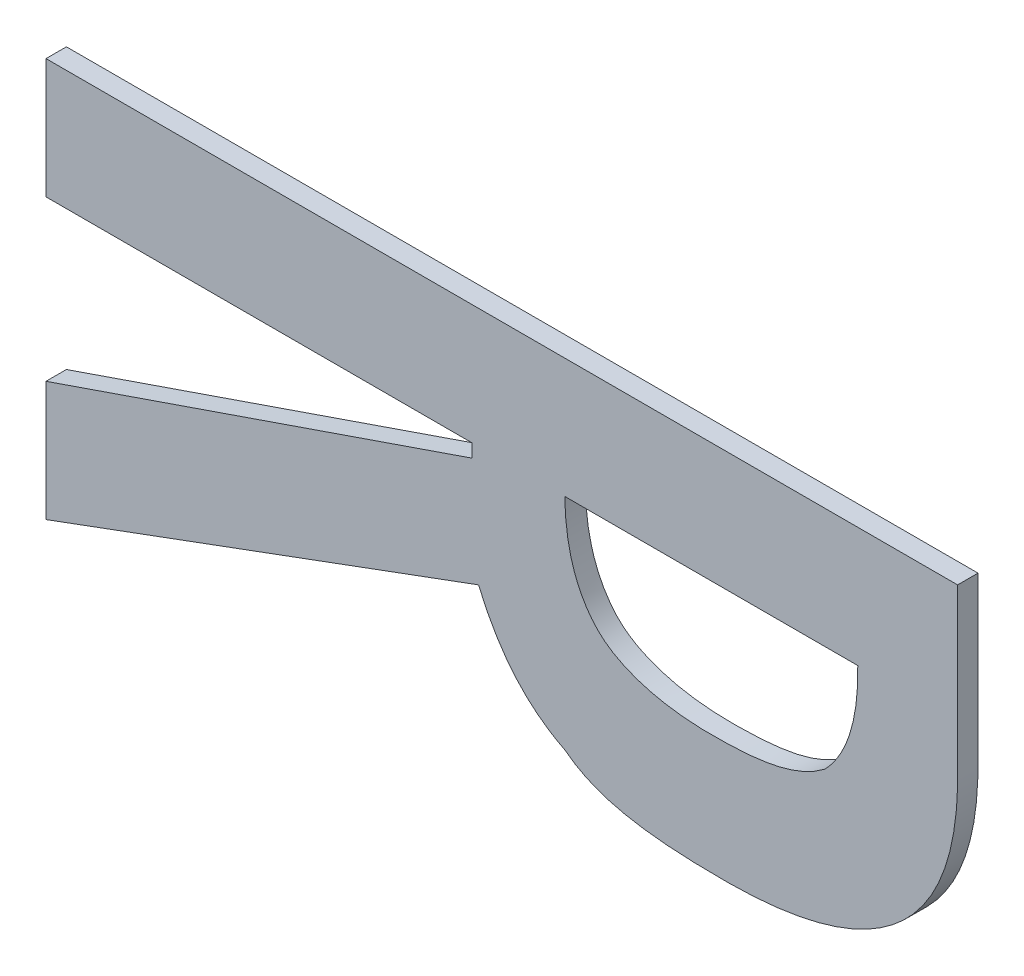
ISO-10303-21;
HEADER;
FILE_DESCRIPTION(('STEP AP214'),'2;1');
FILE_NAME('part.step','',(''),(''),'','','');
FILE_SCHEMA(('AUTOMOTIVE_DESIGN { 1 0 10303 214 1 1 1 1 }'));
ENDSEC;
DATA;
#1=APPLICATION_CONTEXT('core data for automotive mechanical design processes');
#2=APPLICATION_PROTOCOL_DEFINITION('international standard','automotive_design',2000,#1);
#3=PRODUCT_CONTEXT('',#1,'mechanical');
#4=PRODUCT('Part','Part','',(#3));
#5=PRODUCT_RELATED_PRODUCT_CATEGORY('part','',(#4));
#6=PRODUCT_DEFINITION_FORMATION('','',#4);
#7=PRODUCT_DEFINITION_CONTEXT('part definition',#1,'design');
#8=PRODUCT_DEFINITION('design','',#6,#7);
#9=PRODUCT_DEFINITION_SHAPE('','',#8);
#10=(LENGTH_UNIT() NAMED_UNIT(*) SI_UNIT(.MILLI.,.METRE.));
#11=(NAMED_UNIT(*) PLANE_ANGLE_UNIT() SI_UNIT($,.RADIAN.));
#12=(NAMED_UNIT(*) SI_UNIT($,.STERADIAN.) SOLID_ANGLE_UNIT());
#13=UNCERTAINTY_MEASURE_WITH_UNIT(LENGTH_MEASURE(1.E-05),#10,'distance_accuracy_value','');
#14=(GEOMETRIC_REPRESENTATION_CONTEXT(3) GLOBAL_UNCERTAINTY_ASSIGNED_CONTEXT((#13)) GLOBAL_UNIT_ASSIGNED_CONTEXT((#10,
#11,#12)) REPRESENTATION_CONTEXT('',''));
#15=CARTESIAN_POINT('',(0.,0.,0.));
#16=DIRECTION('',(0.,0.,1.));
#17=DIRECTION('',(1.,0.,0.));
#18=AXIS2_PLACEMENT_3D('',#15,#16,#17);
#19=CARTESIAN_POINT('',(-4.103824918965,-11.72933955655,51.9009));
#20=DIRECTION('',(0.,0.,-1.));
#21=DIRECTION('',(-1.,0.,0.));
#22=AXIS2_PLACEMENT_3D('',#19,#20,#21);
#23=PLANE('',#22);
#24=CARTESIAN_POINT('',(-4.234259701574,-11.55977433916,51.9009));
#25=CARTESIAN_POINT('',(-4.22729371960321,-11.552743189971,51.9009));
#26=CARTESIAN_POINT('',(-4.22168818160371,-11.5447199932382,51.9009));
#27=CARTESIAN_POINT('',(-4.21054037672769,-11.5231521968781,51.9009));
#28=CARTESIAN_POINT('',(-4.20641254016962,-11.5088445509134,51.9009));
#29=CARTESIAN_POINT('',(-4.20307244501397,-11.4879917727827,51.9009));
#30=CARTESIAN_POINT('',(-4.20240379489641,-11.4815388863996,51.9009));
#31=CARTESIAN_POINT('',(-4.20183339354768,-11.4717957595793,51.9009));
#32=CARTESIAN_POINT('',(-4.20171575810577,-11.4685243910132,51.9009));
#33=CARTESIAN_POINT('',(-4.2016531207676,-11.4636154110281,51.9009));
#34=CARTESIAN_POINT('',(-4.2016512462555,-11.4619777149783,51.9009));
#35=CARTESIAN_POINT('',(-4.20165094583535,-11.4599305304802,51.9009));
#36=CARTESIAN_POINT('',(-4.201650987896,-11.4595210735979,51.9009));
#37=CARTESIAN_POINT('',(-4.201651023948,-11.4587021608238,51.9009));
#38=CARTESIAN_POINT('',(-4.20165101793933,-11.4582927049319,51.9009));
#39=CARTESIAN_POINT('',(-4.20165098188734,-11.4570643376278,51.9009));
#40=CARTESIAN_POINT('',(-4.20165093381801,-11.4562454265869,51.9009));
#41=CARTESIAN_POINT('',(-4.201651005922,-11.45542651307,51.9009));
#42=B_SPLINE_CURVE_WITH_KNOTS('',3,(#24,#25,#26,#27,#28,#29,#30,#31,#32,#33,#34,#35,#36,#37,#38,
#39,#40,#41),.UNSPECIFIED.,.F.,.F.,(4,2,2,2,2,2,2,2,4),(0.,0.0291820709373025,
0.0728591681443923,0.0923314198639021,0.102145248563685,0.107058452580759,0.108286820627707,
0.109515188674654,0.111971924768555),.UNSPECIFIED.);
#43=CARTESIAN_POINT('',(-4.234259701574,-11.55977433916,51.9009));
#44=VERTEX_POINT('',#43);
#45=CARTESIAN_POINT('',(-4.201651005922,-11.45542651307,51.9009));
#46=VERTEX_POINT('',#45);
#47=EDGE_CURVE('E128',#44,#46,#42,.T.);
#48=ORIENTED_EDGE('',*,*,#47,.T.);
#49=DIRECTION('',(1.,0.,0.));
#50=VECTOR('',#49,1.);
#51=CARTESIAN_POINT('',(-4.3451292667915,-11.45542651307,51.9009));
#52=LINE('',#51,#50);
#53=CARTESIAN_POINT('',(-4.488607527661,-11.45542651307,51.9009));
#54=VERTEX_POINT('',#53);
#55=EDGE_CURVE('E126',#54,#46,#52,.T.);
#56=ORIENTED_EDGE('',*,*,#55,.F.);
#57=CARTESIAN_POINT('',(-4.488607527661,-11.45542651307,51.9009));
#58=CARTESIAN_POINT('',(-4.48859217431152,-11.4650107960418,51.9009));
#59=CARTESIAN_POINT('',(-4.48802745777342,-11.4746928983259,51.9009));
#60=CARTESIAN_POINT('',(-4.48534460191603,-11.4940421550611,51.9009));
#61=CARTESIAN_POINT('',(-4.48319289759382,-11.5037043912539,51.9009));
#62=CARTESIAN_POINT('',(-4.47829486386311,-11.5180871294826,51.9009));
#63=CARTESIAN_POINT('',(-4.47627001546353,-11.5230475148447,51.9009));
#64=CARTESIAN_POINT('',(-4.47154640819921,-11.5326127973051,51.9009));
#65=CARTESIAN_POINT('',(-4.46885156619462,-11.5372195637184,51.9009));
#66=CARTESIAN_POINT('',(-4.46423272554417,-11.5437752068317,51.9009));
#67=CARTESIAN_POINT('',(-4.462580194327,-11.5459182285779,51.9009));
#68=CARTESIAN_POINT('',(-4.45909679354082,-11.5500529807457,51.9009));
#69=CARTESIAN_POINT('',(-4.45726613066443,-11.5520448818505,51.9009));
#70=CARTESIAN_POINT('',(-4.45143428322909,-11.5576674986866,51.9009));
#71=CARTESIAN_POINT('',(-4.44709145579389,-11.5609479355003,51.9009));
#72=CARTESIAN_POINT('',(-4.43686710712427,-11.567353849471,51.9009));
#73=CARTESIAN_POINT('',(-4.43086169335597,-11.5702691710009,51.9009));
#74=CARTESIAN_POINT('',(-4.41847845383723,-11.5752107110331,51.9009));
#75=CARTESIAN_POINT('',(-4.41209884097366,-11.5772321888981,51.9009));
#76=CARTESIAN_POINT('',(-4.3934000914075,-11.582060599396,51.9009));
#77=CARTESIAN_POINT('',(-4.38084922922044,-11.5839647721148,51.9009));
#78=CARTESIAN_POINT('',(-4.35560801310814,-11.5859578978248,51.9009));
#79=CARTESIAN_POINT('',(-4.34291729970915,-11.5860394486285,51.9009));
#80=CARTESIAN_POINT('',(-4.32090604984486,-11.5853883035903,51.9009));
#81=CARTESIAN_POINT('',(-4.31157733692508,-11.5848642015688,51.9009));
#82=CARTESIAN_POINT('',(-4.29309997306678,-11.582816763118,51.9009));
#83=CARTESIAN_POINT('',(-4.28395045774023,-11.5813038201231,51.9009));
#84=CARTESIAN_POINT('',(-4.26777903298391,-11.5770612893029,51.9009));
#85=CARTESIAN_POINT('',(-4.26068775131389,-11.5746234397066,51.9009));
#86=CARTESIAN_POINT('',(-4.25045051862896,-11.5698993073137,51.9009));
#87=CARTESIAN_POINT('',(-4.24706926685425,-11.5681205727284,51.9009));
#88=CARTESIAN_POINT('',(-4.24050329964961,-11.5642095575683,51.9009));
#89=CARTESIAN_POINT('',(-4.23731924947467,-11.5620761611719,51.9009));
#90=CARTESIAN_POINT('',(-4.234259701574,-11.55977433916,51.9009));
#91=B_SPLINE_CURVE_WITH_KNOTS('',3,(#57,#58,#59,#60,#61,#62,#63,#64,#65,#66,#67,#68,#69,#70,#71,
#72,#73,#74,#75,#76,#77,#78,#79,#80,#81,#82,#83,#84,#85,#86,#87,#88,#89,#90),.UNSPECIFIED.,.F.,
.F.,(4,2,2,2,2,2,2,2,2,2,2,2,2,2,2,2,4),(0.,0.0288997839857638,0.0584289927609445,
0.0744592486970659,0.0903979071785619,0.09850833663089,0.106609465003374,0.122802012704199,
0.142728370075268,0.162759178169796,0.200621692160706,0.238637948801372,0.266651605592957,
0.29437545374279,0.316739822929715,0.328180811802465,0.339658501744322),.UNSPECIFIED.);
#92=EDGE_CURVE('E187',#54,#44,#91,.T.);
#93=ORIENTED_EDGE('',*,*,#92,.T.);
#94=EDGE_LOOP('',(#48,#56,#93));
#95=FACE_BOUND('',#94,.T.);
#96=CARTESIAN_POINT('',(-4.488607527661,-11.67064390438,51.9009));
#97=CARTESIAN_POINT('',(-4.49655290488034,-11.6667184582125,51.9009));
#98=CARTESIAN_POINT('',(-4.50413351501535,-11.6620817320312,51.9009));
#99=CARTESIAN_POINT('',(-4.51831250234966,-11.6516492202193,51.9009));
#100=CARTESIAN_POINT('',(-4.52492153248166,-11.6458679439648,51.9009));
#101=CARTESIAN_POINT('',(-4.53860121447045,-11.6317605926403,51.9009));
#102=CARTESIAN_POINT('',(-4.54538516991811,-11.6231583894018,51.9009));
#103=CARTESIAN_POINT('',(-4.55750564624394,-11.6049780811365,51.9009));
#104=CARTESIAN_POINT('',(-4.56283637428216,-11.5953962738909,51.9009));
#105=CARTESIAN_POINT('',(-4.56962744218233,-11.5813471999078,51.9009));
#106=CARTESIAN_POINT('',(-4.57155392744367,-11.5770988342393,51.9009));
#107=CARTESIAN_POINT('',(-4.573390136356,-11.57281781742,51.9009));
#108=B_SPLINE_CURVE_WITH_KNOTS('',3,(#96,#97,#98,#99,#100,#101,#102,#103,#104,#105,#106,#107),
.UNSPECIFIED.,.F.,.F.,(4,2,2,2,2,4),(0.,0.0265348588052677,0.0527526996096151,
0.0854229784977777,0.118221643844576,0.132206858519135),.UNSPECIFIED.);
#109=CARTESIAN_POINT('',(-4.488607527661,-11.67064390438,51.9009));
#110=VERTEX_POINT('',#109);
#111=CARTESIAN_POINT('',(-4.573390136356,-11.57281781742,51.9009));
#112=VERTEX_POINT('',#111);
#113=EDGE_CURVE('E22',#110,#112,#108,.T.);
#114=ORIENTED_EDGE('',*,*,#113,.T.);
#115=DIRECTION('',(0.938096474139897,0.346374082757781,0.));
#116=VECTOR('',#115,1.);
#117=CARTESIAN_POINT('',(-4.7853466580955,-11.651078686985,51.9009));
#118=LINE('',#117,#116);
#119=CARTESIAN_POINT('',(-4.997303179835,-11.72933955655,51.9009));
#120=VERTEX_POINT('',#119);
#121=EDGE_CURVE('E94',#120,#112,#118,.T.);
#122=ORIENTED_EDGE('',*,*,#121,.F.);
#123=DIRECTION('',(0.,-1.,0.));
#124=VECTOR('',#123,1.);
#125=CARTESIAN_POINT('',(-4.997303179835,-11.670643904375,51.9009));
#126=LINE('',#125,#124);
#127=CARTESIAN_POINT('',(-4.997303179835,-11.6119482522,51.9009));
#128=VERTEX_POINT('',#127);
#129=EDGE_CURVE('E129',#128,#120,#126,.T.);
#130=ORIENTED_EDGE('',*,*,#129,.F.);
#131=DIRECTION('',(-0.945686599304607,-0.325079768511804,0.));
#132=VECTOR('',#131,1.);
#133=CARTESIAN_POINT('',(-4.788607527661,-11.540209121765,51.9009));
#134=LINE('',#133,#132);
#135=CARTESIAN_POINT('',(-4.579911875487,-11.46846999133,51.9009));
#136=VERTEX_POINT('',#135);
#137=EDGE_CURVE('E118',#136,#128,#134,.T.);
#138=ORIENTED_EDGE('',*,*,#137,.F.);
#139=DIRECTION('',(0.,-1.,0.));
#140=VECTOR('',#139,1.);
#141=CARTESIAN_POINT('',(-4.579911875487,-11.4619482522,51.9009));
#142=LINE('',#141,#140);
#143=CARTESIAN_POINT('',(-4.579911875487,-11.45542651307,51.9009));
#144=VERTEX_POINT('',#143);
#145=EDGE_CURVE('E152',#144,#136,#142,.T.);
#146=ORIENTED_EDGE('',*,*,#145,.F.);
#147=DIRECTION('',(1.,0.,0.));
#148=VECTOR('',#147,1.);
#149=CARTESIAN_POINT('',(-4.788607527661,-11.45542651307,51.9009));
#150=LINE('',#149,#148);
#151=CARTESIAN_POINT('',(-4.997303179835,-11.45542651307,51.9009));
#152=VERTEX_POINT('',#151);
#153=EDGE_CURVE('E262',#152,#144,#150,.T.);
#154=ORIENTED_EDGE('',*,*,#153,.F.);
#155=DIRECTION('',(0.,-1.,0.));
#156=VECTOR('',#155,1.);
#157=CARTESIAN_POINT('',(-4.997303179835,-11.3967308609,51.9009));
#158=LINE('',#157,#156);
#159=CARTESIAN_POINT('',(-4.997303179835,-11.33803520873,51.9009));
#160=VERTEX_POINT('',#159);
#161=EDGE_CURVE('E143',#160,#152,#158,.T.);
#162=ORIENTED_EDGE('',*,*,#161,.F.);
#163=DIRECTION('',(-1.,0.,0.));
#164=VECTOR('',#163,1.);
#165=CARTESIAN_POINT('',(-4.5505640494,-11.33803520873,51.9009));
#166=LINE('',#165,#164);
#167=CARTESIAN_POINT('',(-4.103824918965,-11.33803520873,51.9009));
#168=VERTEX_POINT('',#167);
#169=EDGE_CURVE('E136',#168,#160,#166,.T.);
#170=ORIENTED_EDGE('',*,*,#169,.F.);
#171=CARTESIAN_POINT('',(-4.103824918965,-11.33803520873,51.9009));
#172=CARTESIAN_POINT('',(-4.1038250178631,-11.3572352039676,51.9009));
#173=CARTESIAN_POINT('',(-4.10382495193103,-11.3764352071425,51.9009));
#174=CARTESIAN_POINT('',(-4.10382490248198,-11.4052352095237,51.9009));
#175=CARTESIAN_POINT('',(-4.10382489424047,-11.4148352099206,51.9009));
#176=CARTESIAN_POINT('',(-4.10382493132726,-11.4292352081347,51.9009));
#177=CARTESIAN_POINT('',(-4.10382495193103,-11.4340352071425,51.9009));
#178=CARTESIAN_POINT('',(-4.10382488599897,-11.4436352103174,51.9009));
#179=CARTESIAN_POINT('',(-4.10382479946313,-11.4484352144845,51.9009));
#180=CARTESIAN_POINT('',(-4.10382503846687,-11.4580352029755,51.9009));
#181=CARTESIAN_POINT('',(-4.10382536400645,-11.4628351872994,51.9009));
#182=CARTESIAN_POINT('',(-4.10382480770464,-11.4688352140876,51.9009));
#183=CARTESIAN_POINT('',(-4.10382464828296,-11.4700352217645,51.9009));
#184=CARTESIAN_POINT('',(-4.10382600169316,-11.4760351565921,51.9009));
#185=CARTESIAN_POINT('',(-4.10383396608077,-11.4808347730732,51.9009));
#186=CARTESIAN_POINT('',(-4.10380678475703,-11.495257291698,51.9009));
#187=CARTESIAN_POINT('',(-4.10372030352894,-11.5048826658634,51.9009));
#188=CARTESIAN_POINT('',(-4.10444760732287,-11.5241071450207,51.9009));
#189=CARTESIAN_POINT('',(-4.10526087381475,-11.5337062619502,51.9009));
#190=CARTESIAN_POINT('',(-4.10794096199321,-11.5528517571005,51.9009));
#191=CARTESIAN_POINT('',(-4.10981740049867,-11.5623968392133,51.9009));
#192=CARTESIAN_POINT('',(-4.11488531074728,-11.5811510510154,51.9009));
#193=CARTESIAN_POINT('',(-4.11807714295075,-11.5903600878641,51.9009));
#194=CARTESIAN_POINT('',(-4.12557306007983,-11.6072377472004,51.9009));
#195=CARTESIAN_POINT('',(-4.12973502199263,-11.6149684935133,51.9009));
#196=CARTESIAN_POINT('',(-4.1393089643298,-11.6296063984846,51.9009));
#197=CARTESIAN_POINT('',(-4.14471919433958,-11.6365146900751,51.9009));
#198=CARTESIAN_POINT('',(-4.15666907295288,-11.6492801227417,51.9009));
#199=CARTESIAN_POINT('',(-4.1632094482896,-11.6551365824709,51.9009));
#200=CARTESIAN_POINT('',(-4.17716906409425,-11.6656932098829,51.9009));
#201=CARTESIAN_POINT('',(-4.18458960178304,-11.6703916386398,51.9009));
#202=CARTESIAN_POINT('',(-4.20306488684662,-11.6802940668158,51.9009));
#203=CARTESIAN_POINT('',(-4.21440036214594,-11.6849690288362,51.9009));
#204=CARTESIAN_POINT('',(-4.23766545204889,-11.6925138845642,51.9009));
#205=CARTESIAN_POINT('',(-4.24959704235428,-11.6953772778416,51.9009));
#206=CARTESIAN_POINT('',(-4.27327603284909,-11.6996117760799,51.9009));
#207=CARTESIAN_POINT('',(-4.2850151487002,-11.7010318304467,51.9009));
#208=CARTESIAN_POINT('',(-4.30268630600238,-11.7024027821786,51.9009));
#209=CARTESIAN_POINT('',(-4.30859341937884,-11.7027331904651,51.9009));
#210=CARTESIAN_POINT('',(-4.32041692753336,-11.703150483807,51.9009));
#211=CARTESIAN_POINT('',(-4.32633332330732,-11.7032373406474,51.9009));
#212=CARTESIAN_POINT('',(-4.33818540692432,-11.7032678880829,51.9009));
#213=CARTESIAN_POINT('',(-4.34412109302252,-11.7032110982624,51.9009));
#214=CARTESIAN_POINT('',(-4.35599021743288,-11.7029918191787,51.9009));
#215=CARTESIAN_POINT('',(-4.36192365570093,-11.7028293279392,51.9009));
#216=CARTESIAN_POINT('',(-4.37970032097444,-11.702104499773,51.9009));
#217=CARTESIAN_POINT('',(-4.39153817397237,-11.7013050403133,51.9009));
#218=CARTESIAN_POINT('',(-4.41251204408465,-11.6989015532327,51.9009));
#219=CARTESIAN_POINT('',(-4.42167105301735,-11.6975125123098,51.9009));
#220=CARTESIAN_POINT('',(-4.43968912644469,-11.693690827672,51.9009));
#221=CARTESIAN_POINT('',(-4.44855038860084,-11.6912699031725,51.9009));
#222=CARTESIAN_POINT('',(-4.46271141595168,-11.6859541707029,51.9009));
#223=CARTESIAN_POINT('',(-4.46817592120408,-11.6835187208186,51.9009));
#224=CARTESIAN_POINT('',(-4.47874920632549,-11.6777792080625,51.9009));
#225=CARTESIAN_POINT('',(-4.48384978061855,-11.6744602540145,51.9009));
#226=CARTESIAN_POINT('',(-4.488607527661,-11.67064390438,51.9009));
#227=B_SPLINE_CURVE_WITH_KNOTS('',3,(#171,#172,#173,#174,#175,#176,#177,#178,#179,#180,#181,
#182,#183,#184,#185,#186,#187,#188,#189,#190,#191,#192,#193,#194,#195,#196,#197,#198,#199,#200,
#201,#202,#203,#204,#205,#206,#207,#208,#209,#210,#211,#212,#213,#214,#215,#216,#217,#218,#219,
#220,#221,#222,#223,#224,#225,#226),.UNSPECIFIED.,.F.,.F.,(4,2,2,2,2,2,2,2,2,2,2,2,2,2,2,2,2,2,
2,2,2,2,2,2,2,2,2,4),(0.,0.0575999999999927,0.08639999999999,0.100799999999988,
0.115199999999985,0.129599999999985,0.133199999999984,0.147599999999984,0.17646362918816,
0.205310632750334,0.234422832819535,0.263543015881341,0.2897681752959,0.315956780972994,
0.342162290176948,0.368406913655974,0.404982611984993,0.441688820985321,0.477103861066305,
0.494849154354383,0.512596503313845,0.530403285399241,0.54821040041557,0.583769832718061,
0.611528098807963,0.638979176162854,0.656861229324732,0.67506619527688),.UNSPECIFIED.);
#228=EDGE_CURVE('E88',#168,#110,#227,.T.);
#229=ORIENTED_EDGE('',*,*,#228,.T.);
#230=EDGE_LOOP('',(#114,#122,#130,#138,#146,#154,#162,#170,#229));
#231=FACE_BOUND('',#230,.T.);
#232=ADVANCED_FACE('F17',(#95,#231),#23,.T.);
#233=CARTESIAN_POINT('',(-4.997303179835,-11.72933955655,51.9209));
#234=DIRECTION('',(0.346374082757781,-0.938096474139897,0.));
#235=DIRECTION('',(0.,0.,-1.));
#236=AXIS2_PLACEMENT_3D('',#233,#234,#235);
#237=PLANE('',#236);
#238=DIRECTION('',(0.,0.,1.));
#239=VECTOR('',#238,1.);
#240=CARTESIAN_POINT('',(-4.997303179835,-11.72933955655,51.9109));
#241=LINE('',#240,#239);
#242=CARTESIAN_POINT('',(-4.997303179835,-11.72933955655,51.9209));
#243=VERTEX_POINT('',#242);
#244=EDGE_CURVE('E104',#120,#243,#241,.T.);
#245=ORIENTED_EDGE('',*,*,#244,.F.);
#246=ORIENTED_EDGE('',*,*,#121,.T.);
#247=DIRECTION('',(0.,0.,1.));
#248=VECTOR('',#247,1.);
#249=CARTESIAN_POINT('',(-4.573390136356,-11.57281781742,51.9153));
#250=LINE('',#249,#248);
#251=CARTESIAN_POINT('',(-4.573390136356,-11.57281781742,51.9209));
#252=VERTEX_POINT('',#251);
#253=EDGE_CURVE('E99',#112,#252,#250,.T.);
#254=ORIENTED_EDGE('',*,*,#253,.T.);
#255=DIRECTION('',(0.938096474139895,0.346374082757784,0.));
#256=VECTOR('',#255,1.);
#257=CARTESIAN_POINT('',(-4.997303179835,-11.72933955655,51.9209));
#258=LINE('',#257,#256);
#259=EDGE_CURVE('E195',#243,#252,#258,.T.);
#260=ORIENTED_EDGE('',*,*,#259,.F.);
#261=EDGE_LOOP('',(#245,#246,#254,#260));
#262=FACE_BOUND('',#261,.T.);
#263=ADVANCED_FACE('F101',(#262),#237,.T.);
#264=CARTESIAN_POINT('',(-4.488607527661,-11.67064390438,51.9009));
#265=CARTESIAN_POINT('',(-4.488607527661,-11.67064390438,51.9297));
#266=CARTESIAN_POINT('',(-4.527737962443,-11.65107868699,51.9009));
#267=CARTESIAN_POINT('',(-4.527737962443,-11.65107868699,51.9297));
#268=CARTESIAN_POINT('',(-4.553824918965,-11.61846999133,51.9009));
#269=CARTESIAN_POINT('',(-4.553824918965,-11.61846999133,51.9297));
#270=CARTESIAN_POINT('',(-4.573390136356,-11.57281781742,51.9009));
#271=CARTESIAN_POINT('',(-4.573390136356,-11.57281781742,51.9297));
#272=B_SPLINE_SURFACE_WITH_KNOTS('',3,1,((#264,#265),(#266,#267),(#268,#269),(#270,#271)),
.UNSPECIFIED.,.F.,.F.,.F.,(4,4),(2,2),(9.,10.),(0.,0.00288),.UNSPECIFIED.);
#273=CARTESIAN_POINT('',(-4.573390136356,-11.57281781742,51.9209));
#274=CARTESIAN_POINT('',(-4.56960619625491,-11.5816385806522,51.9209));
#275=CARTESIAN_POINT('',(-4.56542923546037,-11.5903381595776,51.9209));
#276=CARTESIAN_POINT('',(-4.55602263638039,-11.6072748623933,51.9209));
#277=CARTESIAN_POINT('',(-4.55078118307009,-11.6155053354528,51.9209));
#278=CARTESIAN_POINT('',(-4.53900105726735,-11.6311361772689,51.9209));
#279=CARTESIAN_POINT('',(-4.53245030323309,-11.6385277264926,51.9209));
#280=CARTESIAN_POINT('',(-4.51810258656602,-11.6519074936161,51.9209));
#281=CARTESIAN_POINT('',(-4.51031397006493,-11.6579044904372,51.9209));
#282=CARTESIAN_POINT('',(-4.49986843266559,-11.6644651215651,51.9209));
#283=CARTESIAN_POINT('',(-4.49765964992582,-11.6657759421976,51.9209));
#284=CARTESIAN_POINT('',(-4.49317902003107,-11.6682902396132,51.9209));
#285=CARTESIAN_POINT('',(-4.49090711525351,-11.6694936137872,51.9209));
#286=CARTESIAN_POINT('',(-4.488607527661,-11.67064390438,51.9209));
#287=B_SPLINE_CURVE_WITH_KNOTS('',3,(#273,#274,#275,#276,#277,#278,#279,#280,#281,#282,#283,
#284,#285,#286),.UNSPECIFIED.,.F.,.F.,(4,2,2,2,2,2,4),(0.,0.0288534947048544,0.0580467056167621,
0.0875228876180085,0.11680816070391,0.124511743141741,0.132222605361738),.UNSPECIFIED.);
#288=CARTESIAN_POINT('',(-4.488607527661,-11.67064390438,51.9209));
#289=VERTEX_POINT('',#288);
#290=EDGE_CURVE('E109',#252,#289,#287,.T.);
#291=DIRECTION('',(0.,0.,1.));
#292=VECTOR('',#291,1.);
#293=CARTESIAN_POINT('',(-4.488607527661,-11.67064390438,51.9153));
#294=LINE('',#293,#292);
#295=EDGE_CURVE('E112',#110,#289,#294,.T.);
#296=ORIENTED_EDGE('',*,*,#290,.F.);
#297=ORIENTED_EDGE('',*,*,#253,.F.);
#298=ORIENTED_EDGE('',*,*,#113,.F.);
#299=ORIENTED_EDGE('',*,*,#295,.T.);
#300=EDGE_LOOP('',(#296,#297,#298,#299));
#301=FACE_BOUND('',#300,.T.);
#302=ADVANCED_FACE('F107',(#301),#272,.F.);
#303=CARTESIAN_POINT('',(-4.103824918965,-11.33803520873,51.9009));
#304=CARTESIAN_POINT('',(-4.103824918965,-11.33803520873,51.9297));
#305=CARTESIAN_POINT('',(-4.103824918965,-11.39238303481,51.9009));
#306=CARTESIAN_POINT('',(-4.103824918965,-11.39238303481,51.9297));
#307=CARTESIAN_POINT('',(-4.103824918965,-11.4467308609,51.9009));
#308=CARTESIAN_POINT('',(-4.103824918965,-11.4467308609,51.9297));
#309=CARTESIAN_POINT('',(-4.103824918965,-11.50107868699,51.9009));
#310=CARTESIAN_POINT('',(-4.103824918965,-11.50107868699,51.9297));
#311=CARTESIAN_POINT('',(-4.103824918965,-11.63803520873,51.9009));
#312=CARTESIAN_POINT('',(-4.103824918965,-11.63803520873,51.9297));
#313=CARTESIAN_POINT('',(-4.18208578853,-11.70325260003,51.9009));
#314=CARTESIAN_POINT('',(-4.18208578853,-11.70325260003,51.9297));
#315=CARTESIAN_POINT('',(-4.33208578853,-11.70325260003,51.9009));
#316=CARTESIAN_POINT('',(-4.33208578853,-11.70325260003,51.9297));
#317=CARTESIAN_POINT('',(-4.403824918965,-11.70325260003,51.9009));
#318=CARTESIAN_POINT('',(-4.403824918965,-11.70325260003,51.9297));
#319=CARTESIAN_POINT('',(-4.455998832009,-11.6967308609,51.9009));
#320=CARTESIAN_POINT('',(-4.455998832009,-11.6967308609,51.9297));
#321=CARTESIAN_POINT('',(-4.488607527661,-11.67064390438,51.9009));
#322=CARTESIAN_POINT('',(-4.488607527661,-11.67064390438,51.9297));
#323=B_SPLINE_SURFACE_WITH_KNOTS('',3,1,((#303,#304),(#305,#306),(#307,#308),(#309,#310),(#311,
#312),(#313,#314),(#315,#316),(#317,#318),(#319,#320),(#321,#322)),.UNSPECIFIED.,.F.,.F.,.F.,(4,
3,3,4),(2,2),(6.,7.,8.,9.),(0.,0.00288),.UNSPECIFIED.);
#324=CARTESIAN_POINT('',(-4.488607527661,-11.67064390438,51.9209));
#325=CARTESIAN_POINT('',(-4.48373959816428,-11.6745476149699,51.9209));
#326=CARTESIAN_POINT('',(-4.47851422758318,-11.6779314094926,51.9209));
#327=CARTESIAN_POINT('',(-4.46768453456488,-11.6837598993687,51.9209));
#328=CARTESIAN_POINT('',(-4.46208929551117,-11.6862212117609,51.9209));
#329=CARTESIAN_POINT('',(-4.44985360417395,-11.6907368545638,51.9209));
#330=CARTESIAN_POINT('',(-4.44317641444668,-11.6926861221015,51.9209));
#331=CARTESIAN_POINT('',(-4.42966081050845,-11.6959274442814,51.9209));
#332=CARTESIAN_POINT('',(-4.42282215845123,-11.6972184567002,51.9209));
#333=CARTESIAN_POINT('',(-4.40896376516888,-11.6993441364659,51.9209));
#334=CARTESIAN_POINT('',(-4.40194289109679,-11.700170999385,51.9209));
#335=CARTESIAN_POINT('',(-4.38787375931125,-11.7014792328163,51.9209));
#336=CARTESIAN_POINT('',(-4.38082551402171,-11.7019607450121,51.9209));
#337=CARTESIAN_POINT('',(-4.36421882532953,-11.7027978919303,51.9209));
#338=CARTESIAN_POINT('',(-4.35465565701709,-11.7030485068227,51.9209));
#339=CARTESIAN_POINT('',(-4.33552737118368,-11.7033028226251,51.9209));
#340=CARTESIAN_POINT('',(-4.32596225414326,-11.7033065591671,51.9209));
#341=CARTESIAN_POINT('',(-4.30692504573563,-11.7027087914155,51.9209));
#342=CARTESIAN_POINT('',(-4.29745287285806,-11.7021125837917,51.9209));
#343=CARTESIAN_POINT('',(-4.2785829672498,-11.7002253686476,51.9209));
#344=CARTESIAN_POINT('',(-4.26918532125404,-11.6989336460234,51.9209));
#345=CARTESIAN_POINT('',(-4.23795251166318,-11.6931506509653,51.9209));
#346=CARTESIAN_POINT('',(-4.21631958879115,-11.6866912778096,51.9209));
#347=CARTESIAN_POINT('',(-4.18840336611266,-11.6726273586501,51.9209));
#348=CARTESIAN_POINT('',(-4.1806321783428,-11.6679795143685,51.9209));
#349=CARTESIAN_POINT('',(-4.16598319483942,-11.6574478561328,51.9209));
#350=CARTESIAN_POINT('',(-4.15910375881709,-11.651566365085,51.9209));
#351=CARTESIAN_POINT('',(-4.14649405615546,-11.6386346262793,51.9209));
#352=CARTESIAN_POINT('',(-4.14076799008775,-11.6315802712791,51.9209));
#353=CARTESIAN_POINT('',(-4.13064653765031,-11.6165655089348,51.9209));
#354=CARTESIAN_POINT('',(-4.1262534133879,-11.6086035925332,51.9209));
#355=CARTESIAN_POINT('',(-4.11782128560265,-11.5899695205681,51.9209));
#356=CARTESIAN_POINT('',(-4.11416411635227,-11.5791270617447,51.9209));
#357=CARTESIAN_POINT('',(-4.10860960861832,-11.5570177585763,51.9209));
#358=CARTESIAN_POINT('',(-4.10671370408629,-11.5457505761899,51.9209));
#359=CARTESIAN_POINT('',(-4.10489127466922,-11.5285407327728,51.9209));
#360=CARTESIAN_POINT('',(-4.10445612064329,-11.5226436082159,51.9209));
#361=CARTESIAN_POINT('',(-4.10404197729265,-11.5137894637678,51.9209));
#362=CARTESIAN_POINT('',(-4.1039436840152,-11.5108381112164,51.9209));
#363=CARTESIAN_POINT('',(-4.10383726950914,-11.5049335805295,51.9209));
#364=CARTESIAN_POINT('',(-4.10382916304384,-11.5019804021742,51.9209));
#365=CARTESIAN_POINT('',(-4.10381644558682,-11.4931313937926,51.9209));
#366=CARTESIAN_POINT('',(-4.10382336800016,-11.4872358055149,51.9209));
#367=CARTESIAN_POINT('',(-4.10382569444742,-11.4783922542141,51.9209));
#368=CARTESIAN_POINT('',(-4.10382512706771,-11.4754443756331,51.9209));
#369=CARTESIAN_POINT('',(-4.10382471086229,-11.4695486335327,51.9209));
#370=CARTESIAN_POINT('',(-4.10382486203656,-11.4666007700131,51.9209));
#371=CARTESIAN_POINT('',(-4.10382497589343,-11.4607050390231,51.9209));
#372=CARTESIAN_POINT('',(-4.10382493857603,-11.4577571715527,51.9209));
#373=CARTESIAN_POINT('',(-4.10382487974295,-11.4489135702547,51.9209));
#374=CARTESIAN_POINT('',(-4.10382491134642,-11.4430178375406,51.9209));
#375=CARTESIAN_POINT('',(-4.10382492277429,-11.4341742377153,51.9209));
#376=CARTESIAN_POINT('',(-4.10382492058736,-11.4312263709812,51.9209));
#377=CARTESIAN_POINT('',(-4.10382491247557,-11.4164870373699,51.9209));
#378=CARTESIAN_POINT('',(-4.10382491501936,-11.4046955706702,51.9209));
#379=CARTESIAN_POINT('',(-4.10382492508505,-11.3746144723715,51.9209));
#380=CARTESIAN_POINT('',(-4.1038249345778,-11.3563248408139,51.9209));
#381=CARTESIAN_POINT('',(-4.103824918965,-11.33803520873,51.9209));
#382=B_SPLINE_CURVE_WITH_KNOTS('',3,(#324,#325,#326,#327,#328,#329,#330,#331,#332,#333,#334,
#335,#336,#337,#338,#339,#340,#341,#342,#343,#344,#345,#346,#347,#348,#349,#350,#351,#352,#353,
#354,#355,#356,#357,#358,#359,#360,#361,#362,#363,#364,#365,#366,#367,#368,#369,#370,#371,#372,
#373,#374,#375,#376,#377,#378,#379,#380,#381),.UNSPECIFIED.,.F.,.F.,(4,2,2,2,2,2,2,2,2,2,2,2,2,
2,2,2,2,2,2,2,2,2,2,2,2,2,2,2,4),(0.,0.0186215543241528,0.0368893978063514,0.0577121332737143,
0.0785677360485879,0.0997642471618759,0.120952057210614,0.149645707709013,0.178335216826169,
0.206773640661867,0.235241359870753,0.30184264572023,0.328902636682032,0.355912124991359,
0.38301827065864,0.410170163557846,0.444306989504202,0.478471583998458,0.496203970979183,
0.505061546356374,0.51392057167033,0.531607771799896,0.540451371864677,0.549294971929459,
0.558138571994241,0.575825772123808,0.58466937218859,0.620043772447719,0.674912667717572),.UNSPECIFIED.);
#383=CARTESIAN_POINT('',(-4.103824918965,-11.33803520873,51.9209));
#384=VERTEX_POINT('',#383);
#385=EDGE_CURVE('E232',#289,#384,#382,.T.);
#386=DIRECTION('',(0.,0.,-1.));
#387=VECTOR('',#386,1.);
#388=CARTESIAN_POINT('',(-4.103824918965,-11.33803520873,51.9109));
#389=LINE('',#388,#387);
#390=EDGE_CURVE('E140',#384,#168,#389,.T.);
#391=ORIENTED_EDGE('',*,*,#385,.F.);
#392=ORIENTED_EDGE('',*,*,#295,.F.);
#393=ORIENTED_EDGE('',*,*,#228,.F.);
#394=ORIENTED_EDGE('',*,*,#390,.F.);
#395=EDGE_LOOP('',(#391,#392,#393,#394));
#396=FACE_BOUND('',#395,.T.);
#397=ADVANCED_FACE('F213',(#396),#323,.F.);
#398=CARTESIAN_POINT('',(-4.997303179835,-11.33803520873,51.9009));
#399=DIRECTION('',(0.,1.,0.));
#400=DIRECTION('',(0.,0.,1.));
#401=AXIS2_PLACEMENT_3D('',#398,#399,#400);
#402=PLANE('',#401);
#403=ORIENTED_EDGE('',*,*,#390,.T.);
#404=ORIENTED_EDGE('',*,*,#169,.T.);
#405=DIRECTION('',(0.,0.,-1.));
#406=VECTOR('',#405,1.);
#407=CARTESIAN_POINT('',(-4.997303179835,-11.33803520873,51.9109));
#408=LINE('',#407,#406);
#409=CARTESIAN_POINT('',(-4.997303179835,-11.33803520873,51.9209));
#410=VERTEX_POINT('',#409);
#411=EDGE_CURVE('E139',#410,#160,#408,.T.);
#412=ORIENTED_EDGE('',*,*,#411,.F.);
#413=DIRECTION('',(-1.,0.,0.));
#414=VECTOR('',#413,1.);
#415=CARTESIAN_POINT('',(-4.5505640494,-11.33803520873,51.9209));
#416=LINE('',#415,#414);
#417=EDGE_CURVE('E238',#384,#410,#416,.T.);
#418=ORIENTED_EDGE('',*,*,#417,.F.);
#419=EDGE_LOOP('',(#403,#404,#412,#418));
#420=FACE_BOUND('',#419,.T.);
#421=ADVANCED_FACE('F219',(#420),#402,.T.);
#422=CARTESIAN_POINT('',(-4.997303179835,-11.45542651307,51.9009));
#423=DIRECTION('',(-1.,0.,0.));
#424=DIRECTION('',(0.,0.,1.));
#425=AXIS2_PLACEMENT_3D('',#422,#423,#424);
#426=PLANE('',#425);
#427=ORIENTED_EDGE('',*,*,#411,.T.);
#428=ORIENTED_EDGE('',*,*,#161,.T.);
#429=DIRECTION('',(0.,0.,-1.));
#430=VECTOR('',#429,1.);
#431=CARTESIAN_POINT('',(-4.997303179835,-11.45542651307,51.9109));
#432=LINE('',#431,#430);
#433=CARTESIAN_POINT('',(-4.997303179835,-11.45542651307,51.9209));
#434=VERTEX_POINT('',#433);
#435=EDGE_CURVE('E146',#434,#152,#432,.T.);
#436=ORIENTED_EDGE('',*,*,#435,.F.);
#437=DIRECTION('',(0.,-1.,0.));
#438=VECTOR('',#437,1.);
#439=CARTESIAN_POINT('',(-4.997303179835,-11.53368738264,51.9209));
#440=LINE('',#439,#438);
#441=EDGE_CURVE('E269',#410,#434,#440,.T.);
#442=ORIENTED_EDGE('',*,*,#441,.F.);
#443=EDGE_LOOP('',(#427,#428,#436,#442));
#444=FACE_BOUND('',#443,.T.);
#445=ADVANCED_FACE('F279',(#444),#426,.T.);
#446=CARTESIAN_POINT('',(-4.997303179835,-11.45542651307,51.9209));
#447=DIRECTION('',(0.,-1.,0.));
#448=DIRECTION('',(0.,0.,-1.));
#449=AXIS2_PLACEMENT_3D('',#446,#447,#448);
#450=PLANE('',#449);
#451=ORIENTED_EDGE('',*,*,#435,.T.);
#452=ORIENTED_EDGE('',*,*,#153,.T.);
#453=DIRECTION('',(0.,0.,-1.));
#454=VECTOR('',#453,1.);
#455=CARTESIAN_POINT('',(-4.579911875487,-11.45542651307,51.9109));
#456=LINE('',#455,#454);
#457=CARTESIAN_POINT('',(-4.579911875487,-11.45542651307,51.9209));
#458=VERTEX_POINT('',#457);
#459=EDGE_CURVE('E259',#458,#144,#456,.T.);
#460=ORIENTED_EDGE('',*,*,#459,.F.);
#461=DIRECTION('',(1.,0.,0.));
#462=VECTOR('',#461,1.);
#463=CARTESIAN_POINT('',(-4.5505640494,-11.45542651307,51.9209));
#464=LINE('',#463,#462);
#465=EDGE_CURVE('E156',#434,#458,#464,.T.);
#466=ORIENTED_EDGE('',*,*,#465,.F.);
#467=EDGE_LOOP('',(#451,#452,#460,#466));
#468=FACE_BOUND('',#467,.T.);
#469=ADVANCED_FACE('F358',(#468),#450,.T.);
#470=CARTESIAN_POINT('',(-4.579911875487,-11.46846999133,51.9009));
#471=DIRECTION('',(-1.,0.,0.));
#472=DIRECTION('',(0.,0.,1.));
#473=AXIS2_PLACEMENT_3D('',#470,#471,#472);
#474=PLANE('',#473);
#475=ORIENTED_EDGE('',*,*,#459,.T.);
#476=ORIENTED_EDGE('',*,*,#145,.T.);
#477=DIRECTION('',(0.,0.,-1.));
#478=VECTOR('',#477,1.);
#479=CARTESIAN_POINT('',(-4.579911875487,-11.46846999133,51.9109));
#480=LINE('',#479,#478);
#481=CARTESIAN_POINT('',(-4.579911875487,-11.46846999133,51.9209));
#482=VERTEX_POINT('',#481);
#483=EDGE_CURVE('E149',#482,#136,#480,.T.);
#484=ORIENTED_EDGE('',*,*,#483,.F.);
#485=DIRECTION('',(0.,-1.,0.));
#486=VECTOR('',#485,1.);
#487=CARTESIAN_POINT('',(-4.579911875487,-11.53368738264,51.9209));
#488=LINE('',#487,#486);
#489=EDGE_CURVE('E153',#458,#482,#488,.T.);
#490=ORIENTED_EDGE('',*,*,#489,.F.);
#491=EDGE_LOOP('',(#475,#476,#484,#490));
#492=FACE_BOUND('',#491,.T.);
#493=ADVANCED_FACE('F348',(#492),#474,.T.);
#494=CARTESIAN_POINT('',(-4.997303179835,-11.6119482522,51.9009));
#495=DIRECTION('',(-0.325079768511804,0.945686599304607,0.));
#496=DIRECTION('',(0.,0.,1.));
#497=AXIS2_PLACEMENT_3D('',#494,#495,#496);
#498=PLANE('',#497);
#499=ORIENTED_EDGE('',*,*,#483,.T.);
#500=ORIENTED_EDGE('',*,*,#137,.T.);
#501=DIRECTION('',(0.,0.,-1.));
#502=VECTOR('',#501,1.);
#503=CARTESIAN_POINT('',(-4.997303179835,-11.6119482522,51.9109));
#504=LINE('',#503,#502);
#505=CARTESIAN_POINT('',(-4.997303179835,-11.6119482522,51.9209));
#506=VERTEX_POINT('',#505);
#507=EDGE_CURVE('E117',#506,#128,#504,.T.);
#508=ORIENTED_EDGE('',*,*,#507,.F.);
#509=DIRECTION('',(-0.945686599304607,-0.325079768511804,0.));
#510=VECTOR('',#509,1.);
#511=CARTESIAN_POINT('',(-4.579911875487,-11.46846999133,51.9209));
#512=LINE('',#511,#510);
#513=EDGE_CURVE('E125',#482,#506,#512,.T.);
#514=ORIENTED_EDGE('',*,*,#513,.F.);
#515=EDGE_LOOP('',(#499,#500,#508,#514));
#516=FACE_BOUND('',#515,.T.);
#517=ADVANCED_FACE('F338',(#516),#498,.T.);
#518=CARTESIAN_POINT('',(-4.997303179835,-11.72933955655,51.9009));
#519=DIRECTION('',(-1.,0.,0.));
#520=DIRECTION('',(0.,0.,1.));
#521=AXIS2_PLACEMENT_3D('',#518,#519,#520);
#522=PLANE('',#521);
#523=ORIENTED_EDGE('',*,*,#507,.T.);
#524=ORIENTED_EDGE('',*,*,#129,.T.);
#525=ORIENTED_EDGE('',*,*,#244,.T.);
#526=DIRECTION('',(0.,-1.,0.));
#527=VECTOR('',#526,1.);
#528=CARTESIAN_POINT('',(-4.997303179835,-11.53368738264,51.9209));
#529=LINE('',#528,#527);
#530=EDGE_CURVE('E121',#506,#243,#529,.T.);
#531=ORIENTED_EDGE('',*,*,#530,.F.);
#532=EDGE_LOOP('',(#523,#524,#525,#531));
#533=FACE_BOUND('',#532,.T.);
#534=ADVANCED_FACE('F306',(#533),#522,.T.);
#535=CARTESIAN_POINT('',(-4.488607527661,-11.45542651307,51.9209));
#536=DIRECTION('',(0.,-1.,0.));
#537=DIRECTION('',(0.,0.,-1.));
#538=AXIS2_PLACEMENT_3D('',#535,#536,#537);
#539=PLANE('',#538);
#540=DIRECTION('',(0.,0.,-1.));
#541=VECTOR('',#540,1.);
#542=CARTESIAN_POINT('',(-4.488607527661,-11.45542651307,51.9153));
#543=LINE('',#542,#541);
#544=CARTESIAN_POINT('',(-4.488607527661,-11.45542651307,51.9209));
#545=VERTEX_POINT('',#544);
#546=EDGE_CURVE('E244',#545,#54,#543,.T.);
#547=ORIENTED_EDGE('',*,*,#546,.T.);
#548=ORIENTED_EDGE('',*,*,#55,.T.);
#549=DIRECTION('',(0.,0.,1.));
#550=VECTOR('',#549,1.);
#551=CARTESIAN_POINT('',(-4.201651005922,-11.45542651307,51.9153));
#552=LINE('',#551,#550);
#553=CARTESIAN_POINT('',(-4.201651005922,-11.45542651307,51.9209));
#554=VERTEX_POINT('',#553);
#555=EDGE_CURVE('E194',#46,#554,#552,.T.);
#556=ORIENTED_EDGE('',*,*,#555,.T.);
#557=DIRECTION('',(1.,0.,0.));
#558=VECTOR('',#557,1.);
#559=CARTESIAN_POINT('',(-4.5505640494,-11.45542651307,51.9209));
#560=LINE('',#559,#558);
#561=EDGE_CURVE('E124',#545,#554,#560,.T.);
#562=ORIENTED_EDGE('',*,*,#561,.F.);
#563=EDGE_LOOP('',(#547,#548,#556,#562));
#564=FACE_BOUND('',#563,.T.);
#565=ADVANCED_FACE('F296',(#564),#539,.T.);
#566=CARTESIAN_POINT('',(-4.234259701574,-11.55977433916,51.9009));
#567=CARTESIAN_POINT('',(-4.234259701574,-11.55977433916,51.9297));
#568=CARTESIAN_POINT('',(-4.214694484182,-11.54020912177,51.9009));
#569=CARTESIAN_POINT('',(-4.214694484182,-11.54020912177,51.9297));
#570=CARTESIAN_POINT('',(-4.201651005922,-11.50760042612,51.9009));
#571=CARTESIAN_POINT('',(-4.201651005922,-11.50760042612,51.9297));
#572=CARTESIAN_POINT('',(-4.201651005922,-11.4619482522,51.9009));
#573=CARTESIAN_POINT('',(-4.201651005922,-11.4619482522,51.9297));
#574=CARTESIAN_POINT('',(-4.201651005922,-11.45977433916,51.9009));
#575=CARTESIAN_POINT('',(-4.201651005922,-11.45977433916,51.9297));
#576=CARTESIAN_POINT('',(-4.201651005922,-11.45760042612,51.9009));
#577=CARTESIAN_POINT('',(-4.201651005922,-11.45760042612,51.9297));
#578=CARTESIAN_POINT('',(-4.201651005922,-11.45542651307,51.9009));
#579=CARTESIAN_POINT('',(-4.201651005922,-11.45542651307,51.9297));
#580=B_SPLINE_SURFACE_WITH_KNOTS('',3,1,((#566,#567),(#568,#569),(#570,#571),(#572,#573),(#574,
#575),(#576,#577),(#578,#579)),.UNSPECIFIED.,.F.,.F.,.F.,(4,3,4),(2,2),(3.,4.,5.),(0.,0.00288),.UNSPECIFIED.);
#581=CARTESIAN_POINT('',(-4.201651005922,-11.45542651307,51.9209));
#582=CARTESIAN_POINT('',(-4.20165378928587,-11.4566264061205,51.9209));
#583=CARTESIAN_POINT('',(-4.20165214536083,-11.4578264437028,51.9209));
#584=CARTESIAN_POINT('',(-4.20164872823003,-11.4614254030193,51.9209));
#585=CARTESIAN_POINT('',(-4.20164846638356,-11.4638244199755,51.9209));
#586=CARTESIAN_POINT('',(-4.20173082714353,-11.4686248388965,51.9209));
#587=CARTESIAN_POINT('',(-4.20181358564713,-11.4710262383225,51.9209));
#588=CARTESIAN_POINT('',(-4.20243407359848,-11.4832194219958,51.9209));
#589=CARTESIAN_POINT('',(-4.20358803812812,-11.4929936098846,51.9209));
#590=CARTESIAN_POINT('',(-4.20763818628519,-11.5121606288245,51.9209));
#591=CARTESIAN_POINT('',(-4.21052487566497,-11.5215552424481,51.9209));
#592=CARTESIAN_POINT('',(-4.21693041600163,-11.5358374118622,51.9209));
#593=CARTESIAN_POINT('',(-4.21974371286085,-11.5410339797878,51.9209));
#594=CARTESIAN_POINT('',(-4.22628824739344,-11.5508916850278,51.9209));
#595=CARTESIAN_POINT('',(-4.23002964771784,-11.5555459942273,51.9209));
#596=CARTESIAN_POINT('',(-4.234259701574,-11.55977433916,51.9209));
#597=B_SPLINE_CURVE_WITH_KNOTS('',3,(#581,#582,#583,#584,#585,#586,#587,#588,#589,#590,#591,
#592,#593,#594,#595,#596),.UNSPECIFIED.,.F.,.F.,(4,2,2,2,2,2,2,4),(0.,0.00359999999999944,
0.0107962538613631,0.0180043066220074,0.047412525114855,0.0766610574267983,0.0943017465167264,
0.112144856783915),.UNSPECIFIED.);
#598=CARTESIAN_POINT('',(-4.234259701574,-11.55977433916,51.9209));
#599=VERTEX_POINT('',#598);
#600=EDGE_CURVE('E34',#554,#599,#597,.T.);
#601=DIRECTION('',(0.,0.,1.));
#602=VECTOR('',#601,1.);
#603=CARTESIAN_POINT('',(-4.234259701574,-11.55977433916,51.9153));
#604=LINE('',#603,#602);
#605=EDGE_CURVE('E43',#44,#599,#604,.T.);
#606=ORIENTED_EDGE('',*,*,#600,.F.);
#607=ORIENTED_EDGE('',*,*,#555,.F.);
#608=ORIENTED_EDGE('',*,*,#47,.F.);
#609=ORIENTED_EDGE('',*,*,#605,.T.);
#610=EDGE_LOOP('',(#606,#607,#608,#609));
#611=FACE_BOUND('',#610,.T.);
#612=ADVANCED_FACE('F174',(#611),#580,.F.);
#613=CARTESIAN_POINT('',(-4.488607527661,-11.45542651307,51.9009));
#614=CARTESIAN_POINT('',(-4.488607527661,-11.45542651307,51.9297));
#615=CARTESIAN_POINT('',(-4.488607527661,-11.50107868699,51.9009));
#616=CARTESIAN_POINT('',(-4.488607527661,-11.50107868699,51.9297));
#617=CARTESIAN_POINT('',(-4.4755640494,-11.53368738264,51.9009));
#618=CARTESIAN_POINT('',(-4.4755640494,-11.53368738264,51.9297));
#619=CARTESIAN_POINT('',(-4.455998832009,-11.55325260003,51.9009));
#620=CARTESIAN_POINT('',(-4.455998832009,-11.55325260003,51.9297));
#621=CARTESIAN_POINT('',(-4.436433614617,-11.57281781742,51.9009));
#622=CARTESIAN_POINT('',(-4.436433614617,-11.57281781742,51.9297));
#623=CARTESIAN_POINT('',(-4.397303179835,-11.58586129568,51.9009));
#624=CARTESIAN_POINT('',(-4.397303179835,-11.58586129568,51.9297));
#625=CARTESIAN_POINT('',(-4.345129266791,-11.58586129568,51.9009));
#626=CARTESIAN_POINT('',(-4.345129266791,-11.58586129568,51.9297));
#627=CARTESIAN_POINT('',(-4.292955353748,-11.58586129568,51.9009));
#628=CARTESIAN_POINT('',(-4.292955353748,-11.58586129568,51.9297));
#629=CARTESIAN_POINT('',(-4.260346658095,-11.57933955655,51.9009));
#630=CARTESIAN_POINT('',(-4.260346658095,-11.57933955655,51.9297));
#631=CARTESIAN_POINT('',(-4.234259701574,-11.55977433916,51.9009));
#632=CARTESIAN_POINT('',(-4.234259701574,-11.55977433916,51.9297));
#633=B_SPLINE_SURFACE_WITH_KNOTS('',3,1,((#613,#614),(#615,#616),(#617,#618),(#619,#620),(#621,
#622),(#623,#624),(#625,#626),(#627,#628),(#629,#630),(#631,#632)),.UNSPECIFIED.,.F.,.F.,.F.,(4,
3,3,4),(2,2),(0.,1.,2.,3.),(0.,0.00288),.UNSPECIFIED.);
#634=CARTESIAN_POINT('',(-4.234259701574,-11.55977433916,51.9209));
#635=CARTESIAN_POINT('',(-4.23922272744013,-11.5635485487164,51.9209));
#636=CARTESIAN_POINT('',(-4.24452879775354,-11.5668229406312,51.9209));
#637=CARTESIAN_POINT('',(-4.25555334666733,-11.5724129556044,51.9209));
#638=CARTESIAN_POINT('',(-4.26126649720714,-11.5747389785421,51.9209));
#639=CARTESIAN_POINT('',(-4.27658196657508,-11.5797398574482,51.9209));
#640=CARTESIAN_POINT('',(-4.28639607802504,-11.5817342055064,51.9209));
#641=CARTESIAN_POINT('',(-4.30628822656061,-11.5844637769337,51.9209));
#642=CARTESIAN_POINT('',(-4.31636803587024,-11.5851810902814,51.9209));
#643=CARTESIAN_POINT('',(-4.32986664707404,-11.5856651747204,51.9209));
#644=CARTESIAN_POINT('',(-4.33327790952511,-11.5857468464778,51.9209));
#645=CARTESIAN_POINT('',(-4.34010119281085,-11.5858550157686,51.9209));
#646=CARTESIAN_POINT('',(-4.34351321335539,-11.5858815243853,51.9209));
#647=CARTESIAN_POINT('',(-4.35374799556459,-11.585805328815,51.9209));
#648=CARTESIAN_POINT('',(-4.36056848894157,-11.5855468504274,51.9209));
#649=CARTESIAN_POINT('',(-4.38089035971352,-11.5839992344003,51.9209));
#650=CARTESIAN_POINT('',(-4.39436584328082,-11.5819465190265,51.9209));
#651=CARTESIAN_POINT('',(-4.41301306054937,-11.5769256133585,51.9209));
#652=CARTESIAN_POINT('',(-4.41850967738072,-11.5751599659867,51.9209));
#653=CARTESIAN_POINT('',(-4.42923594517249,-11.5709511951951,51.9209));
#654=CARTESIAN_POINT('',(-4.43446604095515,-11.5685092475001,51.9209));
#655=CARTESIAN_POINT('',(-4.44348360486892,-11.5633387728815,51.9209));
#656=CARTESIAN_POINT('',(-4.44735301794506,-11.560760001352,51.9209));
#657=CARTESIAN_POINT('',(-4.45449951656064,-11.5548869268645,51.9209));
#658=CARTESIAN_POINT('',(-4.45777748919689,-11.5515937121135,51.9209));
#659=CARTESIAN_POINT('',(-4.46442692553072,-11.5437562461157,51.9209));
#660=CARTESIAN_POINT('',(-4.46765862843388,-11.539096408592,51.9209));
#661=CARTESIAN_POINT('',(-4.47333647743723,-11.5293020322273,51.9209));
#662=CARTESIAN_POINT('',(-4.47577882466357,-11.5241653465595,51.9209));
#663=CARTESIAN_POINT('',(-4.48403464270116,-11.5032963137155,51.9209));
#664=CARTESIAN_POINT('',(-4.48710156490097,-11.4864856494075,51.9209));
#665=CARTESIAN_POINT('',(-4.48846485314792,-11.4649314485159,51.9209));
#666=CARTESIAN_POINT('',(-4.48860458863693,-11.4601636360831,51.9209));
#667=CARTESIAN_POINT('',(-4.488607527661,-11.45542651307,51.9209));
#668=B_SPLINE_CURVE_WITH_KNOTS('',3,(#634,#635,#636,#637,#638,#639,#640,#641,#642,#643,#644,
#645,#646,#647,#648,#649,#650,#651,#652,#653,#654,#655,#656,#657,#658,#659,#660,#661,#662,#663,
#664,#665,#666,#667),.UNSPECIFIED.,.F.,.F.,(4,2,2,2,2,2,2,2,2,2,2,2,2,2,2,2,4),(0.,
0.0186346094117778,0.0370589868383871,0.0669257977578919,0.0972082767150403,0.107445066613511,
0.1176797995583,0.138152229682549,0.178757073437286,0.196045556552467,0.21330417088284,
0.2271832059706,0.241041247743877,0.257965215913174,0.274969460214755,0.325223559752617,
0.339505355373607),.UNSPECIFIED.);
#669=EDGE_CURVE('E11',#599,#545,#668,.T.);
#670=ORIENTED_EDGE('',*,*,#669,.F.);
#671=ORIENTED_EDGE('',*,*,#605,.F.);
#672=ORIENTED_EDGE('',*,*,#92,.F.);
#673=ORIENTED_EDGE('',*,*,#546,.F.);
#674=EDGE_LOOP('',(#670,#671,#672,#673));
#675=FACE_BOUND('',#674,.T.);
#676=ADVANCED_FACE('F169',(#675),#633,.F.);
#677=CARTESIAN_POINT('',(-4.997303179835,-11.72933955655,51.9209));
#678=DIRECTION('',(0.,0.,1.));
#679=DIRECTION('',(1.,0.,0.));
#680=AXIS2_PLACEMENT_3D('',#677,#678,#679);
#681=PLANE('',#680);
#682=ORIENTED_EDGE('',*,*,#600,.T.);
#683=ORIENTED_EDGE('',*,*,#669,.T.);
#684=ORIENTED_EDGE('',*,*,#561,.T.);
#685=EDGE_LOOP('',(#682,#683,#684));
#686=FACE_BOUND('',#685,.T.);
#687=ORIENTED_EDGE('',*,*,#513,.T.);
#688=ORIENTED_EDGE('',*,*,#530,.T.);
#689=ORIENTED_EDGE('',*,*,#259,.T.);
#690=ORIENTED_EDGE('',*,*,#290,.T.);
#691=ORIENTED_EDGE('',*,*,#385,.T.);
#692=ORIENTED_EDGE('',*,*,#417,.T.);
#693=ORIENTED_EDGE('',*,*,#441,.T.);
#694=ORIENTED_EDGE('',*,*,#465,.T.);
#695=ORIENTED_EDGE('',*,*,#489,.T.);
#696=EDGE_LOOP('',(#687,#688,#689,#690,#691,#692,#693,#694,#695));
#697=FACE_BOUND('',#696,.T.);
#698=ADVANCED_FACE('F19',(#686,#697),#681,.T.);
#699=CLOSED_SHELL('',(#232,#263,#302,#397,#421,#445,#469,#493,#517,#534,#565,#612,#676,#698));
#700=MANIFOLD_SOLID_BREP('B1',#699);
#701=ADVANCED_BREP_SHAPE_REPRESENTATION('',(#18,#700),#14);
#702=SHAPE_DEFINITION_REPRESENTATION(#9,#701);
ENDSEC;
END-ISO-10303-21;
